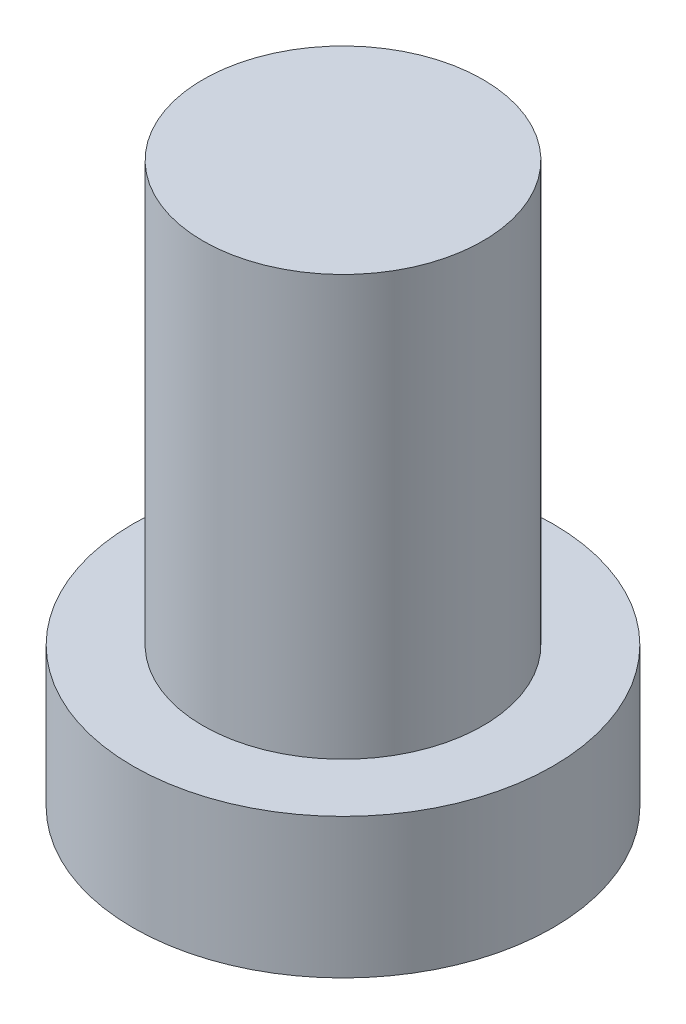
ISO-10303-21;
HEADER;
FILE_DESCRIPTION(('STEP AP214'),'2;1');
FILE_NAME('part.step','',(''),(''),'','','');
FILE_SCHEMA(('AUTOMOTIVE_DESIGN { 1 0 10303 214 1 1 1 1 }'));
ENDSEC;
DATA;
#1=APPLICATION_CONTEXT('core data for automotive mechanical design processes');
#2=APPLICATION_PROTOCOL_DEFINITION('international standard','automotive_design',2000,#1);
#3=PRODUCT_CONTEXT('',#1,'mechanical');
#4=PRODUCT('Part','Part','',(#3));
#5=PRODUCT_RELATED_PRODUCT_CATEGORY('part','',(#4));
#6=PRODUCT_DEFINITION_FORMATION('','',#4);
#7=PRODUCT_DEFINITION_CONTEXT('part definition',#1,'design');
#8=PRODUCT_DEFINITION('design','',#6,#7);
#9=PRODUCT_DEFINITION_SHAPE('','',#8);
#10=(LENGTH_UNIT() NAMED_UNIT(*) SI_UNIT(.MILLI.,.METRE.));
#11=(NAMED_UNIT(*) PLANE_ANGLE_UNIT() SI_UNIT($,.RADIAN.));
#12=(NAMED_UNIT(*) SI_UNIT($,.STERADIAN.) SOLID_ANGLE_UNIT());
#13=UNCERTAINTY_MEASURE_WITH_UNIT(LENGTH_MEASURE(1.E-05),#10,'distance_accuracy_value','');
#14=(GEOMETRIC_REPRESENTATION_CONTEXT(3) GLOBAL_UNCERTAINTY_ASSIGNED_CONTEXT((#13)) GLOBAL_UNIT_ASSIGNED_CONTEXT((#10,
#11,#12)) REPRESENTATION_CONTEXT('',''));
#15=CARTESIAN_POINT('',(0.,0.,0.));
#16=DIRECTION('',(0.,0.,1.));
#17=DIRECTION('',(1.,0.,0.));
#18=AXIS2_PLACEMENT_3D('',#15,#16,#17);
#19=CARTESIAN_POINT('',(0.,10.,0.));
#20=DIRECTION('',(0.,-1.,0.));
#21=DIRECTION('',(0.,0.,-1.));
#22=AXIS2_PLACEMENT_3D('',#19,#20,#21);
#23=CYLINDRICAL_SURFACE('',#22,15.);
#24=CARTESIAN_POINT('',(0.,10.,0.));
#25=DIRECTION('',(0.,1.,0.));
#26=DIRECTION('',(0.,0.,1.));
#27=AXIS2_PLACEMENT_3D('',#24,#25,#26);
#28=CIRCLE('',#27,15.);
#29=CARTESIAN_POINT('',(0.,10.,15.));
#30=VERTEX_POINT('',#29);
#31=EDGE_CURVE('E52',#30,#30,#28,.T.);
#32=ORIENTED_EDGE('',*,*,#31,.F.);
#33=EDGE_LOOP('',(#32));
#34=FACE_BOUND('',#33,.T.);
#35=CARTESIAN_POINT('',(0.,0.,0.));
#36=DIRECTION('',(0.,1.,0.));
#37=DIRECTION('',(0.,0.,1.));
#38=AXIS2_PLACEMENT_3D('',#35,#36,#37);
#39=CIRCLE('',#38,15.);
#40=CARTESIAN_POINT('',(0.,0.,15.));
#41=VERTEX_POINT('',#40);
#42=EDGE_CURVE('E48',#41,#41,#39,.T.);
#43=ORIENTED_EDGE('',*,*,#42,.T.);
#44=EDGE_LOOP('',(#43));
#45=FACE_BOUND('',#44,.T.);
#46=ADVANCED_FACE('F45',(#34,#45),#23,.T.);
#47=CARTESIAN_POINT('',(0.,10.,0.));
#48=DIRECTION('',(0.,1.,0.));
#49=DIRECTION('',(0.,0.,1.));
#50=AXIS2_PLACEMENT_3D('',#47,#48,#49);
#51=PLANE('',#50);
#52=CARTESIAN_POINT('',(0.,10.,0.));
#53=DIRECTION('',(0.,1.,0.));
#54=DIRECTION('',(0.,0.,1.));
#55=AXIS2_PLACEMENT_3D('',#52,#53,#54);
#56=CIRCLE('',#55,10.);
#57=CARTESIAN_POINT('',(0.,10.,10.));
#58=VERTEX_POINT('',#57);
#59=EDGE_CURVE('E11',#58,#58,#56,.T.);
#60=ORIENTED_EDGE('',*,*,#59,.F.);
#61=EDGE_LOOP('',(#60));
#62=FACE_BOUND('',#61,.T.);
#63=ORIENTED_EDGE('',*,*,#31,.T.);
#64=EDGE_LOOP('',(#63));
#65=FACE_BOUND('',#64,.T.);
#66=ADVANCED_FACE('F72',(#62,#65),#51,.T.);
#67=CARTESIAN_POINT('',(0.,0.,0.));
#68=DIRECTION('',(0.,1.,0.));
#69=DIRECTION('',(0.,0.,1.));
#70=AXIS2_PLACEMENT_3D('',#67,#68,#69);
#71=PLANE('',#70);
#72=ORIENTED_EDGE('',*,*,#42,.F.);
#73=EDGE_LOOP('',(#72));
#74=FACE_BOUND('',#73,.T.);
#75=ADVANCED_FACE('F69',(#74),#71,.F.);
#76=CARTESIAN_POINT('',(0.,40.,0.));
#77=DIRECTION('',(0.,-1.,0.));
#78=DIRECTION('',(0.,0.,-1.));
#79=AXIS2_PLACEMENT_3D('',#76,#77,#78);
#80=CYLINDRICAL_SURFACE('',#79,10.);
#81=CARTESIAN_POINT('',(0.,40.,0.));
#82=DIRECTION('',(0.,1.,0.));
#83=DIRECTION('',(0.,0.,1.));
#84=AXIS2_PLACEMENT_3D('',#81,#82,#83);
#85=CIRCLE('',#84,10.);
#86=CARTESIAN_POINT('',(0.,40.,10.));
#87=VERTEX_POINT('',#86);
#88=EDGE_CURVE('E58',#87,#87,#85,.T.);
#89=ORIENTED_EDGE('',*,*,#88,.F.);
#90=EDGE_LOOP('',(#89));
#91=FACE_BOUND('',#90,.T.);
#92=ORIENTED_EDGE('',*,*,#59,.T.);
#93=EDGE_LOOP('',(#92));
#94=FACE_BOUND('',#93,.T.);
#95=ADVANCED_FACE('F71',(#91,#94),#80,.T.);
#96=CARTESIAN_POINT('',(0.,40.,0.));
#97=DIRECTION('',(0.,1.,0.));
#98=DIRECTION('',(0.,0.,1.));
#99=AXIS2_PLACEMENT_3D('',#96,#97,#98);
#100=PLANE('',#99);
#101=ORIENTED_EDGE('',*,*,#88,.T.);
#102=EDGE_LOOP('',(#101));
#103=FACE_BOUND('',#102,.T.);
#104=ADVANCED_FACE('F77',(#103),#100,.T.);
#105=CLOSED_SHELL('',(#46,#66,#75,#95,#104));
#106=MANIFOLD_SOLID_BREP('B2',#105);
#107=ADVANCED_BREP_SHAPE_REPRESENTATION('',(#18,#106),#14);
#108=SHAPE_DEFINITION_REPRESENTATION(#9,#107);
ENDSEC;
END-ISO-10303-21;
